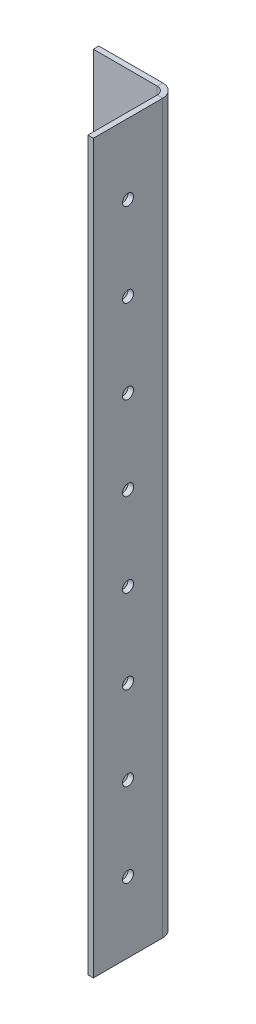
ISO-10303-21;
HEADER;
FILE_DESCRIPTION(('STEP AP214'),'2;1');
FILE_NAME('part.step','',(''),(''),'','','');
FILE_SCHEMA(('AUTOMOTIVE_DESIGN { 1 0 10303 214 1 1 1 1 }'));
ENDSEC;
DATA;
#1=APPLICATION_CONTEXT('core data for automotive mechanical design processes');
#2=APPLICATION_PROTOCOL_DEFINITION('international standard','automotive_design',2000,#1);
#3=PRODUCT_CONTEXT('',#1,'mechanical');
#4=PRODUCT('Part','Part','',(#3));
#5=PRODUCT_RELATED_PRODUCT_CATEGORY('part','',(#4));
#6=PRODUCT_DEFINITION_FORMATION('','',#4);
#7=PRODUCT_DEFINITION_CONTEXT('part definition',#1,'design');
#8=PRODUCT_DEFINITION('design','',#6,#7);
#9=PRODUCT_DEFINITION_SHAPE('','',#8);
#10=(LENGTH_UNIT() NAMED_UNIT(*) SI_UNIT(.MILLI.,.METRE.));
#11=(NAMED_UNIT(*) PLANE_ANGLE_UNIT() SI_UNIT($,.RADIAN.));
#12=(NAMED_UNIT(*) SI_UNIT($,.STERADIAN.) SOLID_ANGLE_UNIT());
#13=UNCERTAINTY_MEASURE_WITH_UNIT(LENGTH_MEASURE(1.E-05),#10,'distance_accuracy_value','');
#14=(GEOMETRIC_REPRESENTATION_CONTEXT(3) GLOBAL_UNCERTAINTY_ASSIGNED_CONTEXT((#13)) GLOBAL_UNIT_ASSIGNED_CONTEXT((#10,
#11,#12)) REPRESENTATION_CONTEXT('',''));
#15=CARTESIAN_POINT('',(0.,0.,0.));
#16=DIRECTION('',(0.,0.,1.));
#17=DIRECTION('',(1.,0.,0.));
#18=AXIS2_PLACEMENT_3D('',#15,#16,#17);
#19=CARTESIAN_POINT('',(-70.,660.,-10.));
#20=DIRECTION('',(0.,1.,0.));
#21=DIRECTION('',(0.,0.,1.));
#22=AXIS2_PLACEMENT_3D('',#19,#20,#21);
#23=PLANE('',#22);
#24=DIRECTION('',(-1.,0.,0.));
#25=VECTOR('',#24,1.);
#26=CARTESIAN_POINT('',(-70.,660.,0.));
#27=LINE('',#26,#25);
#28=CARTESIAN_POINT('',(46.0000000000001,660.,0.));
#29=VERTEX_POINT('',#28);
#30=CARTESIAN_POINT('',(-70.,660.,0.));
#31=VERTEX_POINT('',#30);
#32=EDGE_CURVE('E104',#29,#31,#27,.T.);
#33=ORIENTED_EDGE('',*,*,#32,.F.);
#34=DIRECTION('',(0.,0.,-1.));
#35=VECTOR('',#34,1.);
#36=CARTESIAN_POINT('',(46.0000000000001,660.,0.));
#37=LINE('',#36,#35);
#38=CARTESIAN_POINT('',(46.0000000000001,660.,-10.0000000000001));
#39=VERTEX_POINT('',#38);
#40=EDGE_CURVE('E117',#29,#39,#37,.T.);
#41=ORIENTED_EDGE('',*,*,#40,.T.);
#42=DIRECTION('',(-1.,0.,0.));
#43=VECTOR('',#42,1.);
#44=CARTESIAN_POINT('',(-70.,660.,-10.));
#45=LINE('',#44,#43);
#46=CARTESIAN_POINT('',(-70.,660.,-10.));
#47=VERTEX_POINT('',#46);
#48=EDGE_CURVE('E109',#39,#47,#45,.T.);
#49=ORIENTED_EDGE('',*,*,#48,.T.);
#50=DIRECTION('',(0.,0.,1.));
#51=VECTOR('',#50,1.);
#52=CARTESIAN_POINT('',(-70.,660.,-10.));
#53=LINE('',#52,#51);
#54=EDGE_CURVE('E59',#47,#31,#53,.T.);
#55=ORIENTED_EDGE('',*,*,#54,.T.);
#56=EDGE_LOOP('',(#33,#41,#49,#55));
#57=FACE_BOUND('',#56,.T.);
#58=ADVANCED_FACE('F56',(#57),#23,.T.);
#59=CARTESIAN_POINT('',(0.,0.,-10.));
#60=DIRECTION('',(0.,0.,-1.));
#61=DIRECTION('',(-1.,0.,0.));
#62=AXIS2_PLACEMENT_3D('',#59,#60,#61);
#63=PLANE('',#62);
#64=CARTESIAN_POINT('',(-7.00000000000001,380.,-9.99999999999999));
#65=DIRECTION('',(0.,0.,1.));
#66=DIRECTION('',(1.,0.,0.));
#67=AXIS2_PLACEMENT_3D('',#64,#65,#66);
#68=CIRCLE('',#67,10.);
#69=CARTESIAN_POINT('',(3.00000000000001,380.,-9.99999999999999));
#70=VERTEX_POINT('',#69);
#71=EDGE_CURVE('E192',#70,#70,#68,.T.);
#72=ORIENTED_EDGE('',*,*,#71,.T.);
#73=EDGE_LOOP('',(#72));
#74=FACE_BOUND('',#73,.T.);
#75=CARTESIAN_POINT('',(-7.00000000000001,228.,-9.99999999999998));
#76=DIRECTION('',(0.,0.,1.));
#77=DIRECTION('',(1.,0.,0.));
#78=AXIS2_PLACEMENT_3D('',#75,#76,#77);
#79=CIRCLE('',#78,10.);
#80=CARTESIAN_POINT('',(3.00000000000001,228.,-9.99999999999998));
#81=VERTEX_POINT('',#80);
#82=EDGE_CURVE('E260',#81,#81,#79,.T.);
#83=ORIENTED_EDGE('',*,*,#82,.T.);
#84=EDGE_LOOP('',(#83));
#85=FACE_BOUND('',#84,.T.);
#86=CARTESIAN_POINT('',(-7.00000000000001,76.,-9.99999999999997));
#87=DIRECTION('',(0.,0.,1.));
#88=DIRECTION('',(1.,0.,0.));
#89=AXIS2_PLACEMENT_3D('',#86,#87,#88);
#90=CIRCLE('',#89,10.);
#91=CARTESIAN_POINT('',(3.00000000000001,76.,-9.99999999999997));
#92=VERTEX_POINT('',#91);
#93=EDGE_CURVE('E254',#92,#92,#90,.T.);
#94=ORIENTED_EDGE('',*,*,#93,.T.);
#95=EDGE_LOOP('',(#94));
#96=FACE_BOUND('',#95,.T.);
#97=CARTESIAN_POINT('',(-7.00000000000001,-76.0000000000001,-9.99999999999996));
#98=DIRECTION('',(0.,0.,1.));
#99=DIRECTION('',(1.,0.,0.));
#100=AXIS2_PLACEMENT_3D('',#97,#98,#99);
#101=CIRCLE('',#100,10.);
#102=CARTESIAN_POINT('',(3.00000000000001,-76.0000000000001,-9.99999999999996));
#103=VERTEX_POINT('',#102);
#104=EDGE_CURVE('E248',#103,#103,#101,.T.);
#105=ORIENTED_EDGE('',*,*,#104,.T.);
#106=EDGE_LOOP('',(#105));
#107=FACE_BOUND('',#106,.T.);
#108=CARTESIAN_POINT('',(-7.00000000000001,-228.,-9.99999999999995));
#109=DIRECTION('',(0.,0.,1.));
#110=DIRECTION('',(1.,0.,0.));
#111=AXIS2_PLACEMENT_3D('',#108,#109,#110);
#112=CIRCLE('',#111,10.);
#113=CARTESIAN_POINT('',(3.00000000000001,-228.,-9.99999999999995));
#114=VERTEX_POINT('',#113);
#115=EDGE_CURVE('E242',#114,#114,#112,.T.);
#116=ORIENTED_EDGE('',*,*,#115,.T.);
#117=EDGE_LOOP('',(#116));
#118=FACE_BOUND('',#117,.T.);
#119=CARTESIAN_POINT('',(-7.00000000000001,-380.,-9.99999999999994));
#120=DIRECTION('',(0.,0.,1.));
#121=DIRECTION('',(1.,0.,0.));
#122=AXIS2_PLACEMENT_3D('',#119,#120,#121);
#123=CIRCLE('',#122,10.);
#124=CARTESIAN_POINT('',(3.00000000000001,-380.,-9.99999999999994));
#125=VERTEX_POINT('',#124);
#126=EDGE_CURVE('E236',#125,#125,#123,.T.);
#127=ORIENTED_EDGE('',*,*,#126,.T.);
#128=EDGE_LOOP('',(#127));
#129=FACE_BOUND('',#128,.T.);
#130=CARTESIAN_POINT('',(-7.00000000000001,-532.,-9.99999999999993));
#131=DIRECTION('',(0.,0.,1.));
#132=DIRECTION('',(1.,0.,0.));
#133=AXIS2_PLACEMENT_3D('',#130,#131,#132);
#134=CIRCLE('',#133,10.);
#135=CARTESIAN_POINT('',(3.00000000000001,-532.,-9.99999999999993));
#136=VERTEX_POINT('',#135);
#137=EDGE_CURVE('E230',#136,#136,#134,.T.);
#138=ORIENTED_EDGE('',*,*,#137,.T.);
#139=EDGE_LOOP('',(#138));
#140=FACE_BOUND('',#139,.T.);
#141=CARTESIAN_POINT('',(-7.00000000000001,532.,-10.));
#142=DIRECTION('',(0.,0.,1.));
#143=DIRECTION('',(1.,0.,0.));
#144=AXIS2_PLACEMENT_3D('',#141,#142,#143);
#145=CIRCLE('',#144,10.);
#146=CARTESIAN_POINT('',(3.00000000000001,532.,-10.));
#147=VERTEX_POINT('',#146);
#148=EDGE_CURVE('E176',#147,#147,#145,.T.);
#149=ORIENTED_EDGE('',*,*,#148,.T.);
#150=EDGE_LOOP('',(#149));
#151=FACE_BOUND('',#150,.T.);
#152=ORIENTED_EDGE('',*,*,#48,.F.);
#153=DIRECTION('',(0.,1.,0.));
#154=VECTOR('',#153,1.);
#155=CARTESIAN_POINT('',(46.0000000000001,660.,-10.0000000000001));
#156=LINE('',#155,#154);
#157=CARTESIAN_POINT('',(46.0000000000001,-660.,-10.));
#158=VERTEX_POINT('',#157);
#159=EDGE_CURVE('E134',#39,#158,#156,.F.);
#160=ORIENTED_EDGE('',*,*,#159,.T.);
#161=DIRECTION('',(1.,0.,0.));
#162=VECTOR('',#161,1.);
#163=CARTESIAN_POINT('',(-70.,-660.,-10.));
#164=LINE('',#163,#162);
#165=CARTESIAN_POINT('',(-70.,-660.,-10.));
#166=VERTEX_POINT('',#165);
#167=EDGE_CURVE('E114',#166,#158,#164,.T.);
#168=ORIENTED_EDGE('',*,*,#167,.F.);
#169=DIRECTION('',(0.,-1.,0.));
#170=VECTOR('',#169,1.);
#171=CARTESIAN_POINT('',(-70.,-660.,-10.));
#172=LINE('',#171,#170);
#173=EDGE_CURVE('E94',#47,#166,#172,.T.);
#174=ORIENTED_EDGE('',*,*,#173,.F.);
#175=EDGE_LOOP('',(#152,#160,#168,#174));
#176=FACE_BOUND('',#175,.T.);
#177=ADVANCED_FACE('F269',(#74,#85,#96,#107,#118,#129,#140,#151,#176),#63,.T.);
#178=CARTESIAN_POINT('',(0.,0.,0.));
#179=DIRECTION('',(0.,0.,-1.));
#180=DIRECTION('',(-1.,0.,0.));
#181=AXIS2_PLACEMENT_3D('',#178,#179,#180);
#182=PLANE('',#181);
#183=CARTESIAN_POINT('',(-7.00000000000001,380.,0.));
#184=DIRECTION('',(0.,0.,1.));
#185=DIRECTION('',(1.,0.,0.));
#186=AXIS2_PLACEMENT_3D('',#183,#184,#185);
#187=CIRCLE('',#186,10.);
#188=CARTESIAN_POINT('',(3.00000000000001,380.,0.));
#189=VERTEX_POINT('',#188);
#190=EDGE_CURVE('E263',#189,#189,#187,.T.);
#191=ORIENTED_EDGE('',*,*,#190,.F.);
#192=EDGE_LOOP('',(#191));
#193=FACE_BOUND('',#192,.T.);
#194=CARTESIAN_POINT('',(-7.00000000000001,228.,0.));
#195=DIRECTION('',(0.,0.,1.));
#196=DIRECTION('',(1.,0.,0.));
#197=AXIS2_PLACEMENT_3D('',#194,#195,#196);
#198=CIRCLE('',#197,10.);
#199=CARTESIAN_POINT('',(3.00000000000001,228.,0.));
#200=VERTEX_POINT('',#199);
#201=EDGE_CURVE('E257',#200,#200,#198,.T.);
#202=ORIENTED_EDGE('',*,*,#201,.F.);
#203=EDGE_LOOP('',(#202));
#204=FACE_BOUND('',#203,.T.);
#205=CARTESIAN_POINT('',(-7.00000000000001,76.,0.));
#206=DIRECTION('',(0.,0.,1.));
#207=DIRECTION('',(1.,0.,0.));
#208=AXIS2_PLACEMENT_3D('',#205,#206,#207);
#209=CIRCLE('',#208,10.);
#210=CARTESIAN_POINT('',(3.00000000000001,76.,0.));
#211=VERTEX_POINT('',#210);
#212=EDGE_CURVE('E251',#211,#211,#209,.T.);
#213=ORIENTED_EDGE('',*,*,#212,.F.);
#214=EDGE_LOOP('',(#213));
#215=FACE_BOUND('',#214,.T.);
#216=CARTESIAN_POINT('',(-7.00000000000001,-76.0000000000001,0.));
#217=DIRECTION('',(0.,0.,1.));
#218=DIRECTION('',(1.,0.,0.));
#219=AXIS2_PLACEMENT_3D('',#216,#217,#218);
#220=CIRCLE('',#219,10.);
#221=CARTESIAN_POINT('',(3.00000000000001,-76.0000000000001,0.));
#222=VERTEX_POINT('',#221);
#223=EDGE_CURVE('E245',#222,#222,#220,.T.);
#224=ORIENTED_EDGE('',*,*,#223,.F.);
#225=EDGE_LOOP('',(#224));
#226=FACE_BOUND('',#225,.T.);
#227=CARTESIAN_POINT('',(-7.00000000000001,-228.,0.));
#228=DIRECTION('',(0.,0.,1.));
#229=DIRECTION('',(1.,0.,0.));
#230=AXIS2_PLACEMENT_3D('',#227,#228,#229);
#231=CIRCLE('',#230,10.);
#232=CARTESIAN_POINT('',(3.00000000000001,-228.,0.));
#233=VERTEX_POINT('',#232);
#234=EDGE_CURVE('E239',#233,#233,#231,.T.);
#235=ORIENTED_EDGE('',*,*,#234,.F.);
#236=EDGE_LOOP('',(#235));
#237=FACE_BOUND('',#236,.T.);
#238=CARTESIAN_POINT('',(-7.00000000000001,-380.,0.));
#239=DIRECTION('',(0.,0.,1.));
#240=DIRECTION('',(1.,0.,0.));
#241=AXIS2_PLACEMENT_3D('',#238,#239,#240);
#242=CIRCLE('',#241,10.);
#243=CARTESIAN_POINT('',(3.00000000000001,-380.,0.));
#244=VERTEX_POINT('',#243);
#245=EDGE_CURVE('E233',#244,#244,#242,.T.);
#246=ORIENTED_EDGE('',*,*,#245,.F.);
#247=EDGE_LOOP('',(#246));
#248=FACE_BOUND('',#247,.T.);
#249=CARTESIAN_POINT('',(-7.00000000000001,-532.,0.));
#250=DIRECTION('',(0.,0.,1.));
#251=DIRECTION('',(1.,0.,0.));
#252=AXIS2_PLACEMENT_3D('',#249,#250,#251);
#253=CIRCLE('',#252,10.);
#254=CARTESIAN_POINT('',(3.00000000000001,-532.,0.));
#255=VERTEX_POINT('',#254);
#256=EDGE_CURVE('E227',#255,#255,#253,.T.);
#257=ORIENTED_EDGE('',*,*,#256,.F.);
#258=EDGE_LOOP('',(#257));
#259=FACE_BOUND('',#258,.T.);
#260=CARTESIAN_POINT('',(-7.00000000000001,532.,0.));
#261=DIRECTION('',(0.,0.,1.));
#262=DIRECTION('',(1.,0.,0.));
#263=AXIS2_PLACEMENT_3D('',#260,#261,#262);
#264=CIRCLE('',#263,10.);
#265=CARTESIAN_POINT('',(3.00000000000001,532.,0.));
#266=VERTEX_POINT('',#265);
#267=EDGE_CURVE('E179',#266,#266,#264,.T.);
#268=ORIENTED_EDGE('',*,*,#267,.F.);
#269=EDGE_LOOP('',(#268));
#270=FACE_BOUND('',#269,.T.);
#271=DIRECTION('',(0.,1.,0.));
#272=VECTOR('',#271,1.);
#273=CARTESIAN_POINT('',(46.0000000000001,660.,0.));
#274=LINE('',#273,#272);
#275=CARTESIAN_POINT('',(46.0000000000001,-660.,0.));
#276=VERTEX_POINT('',#275);
#277=EDGE_CURVE('E124',#29,#276,#274,.F.);
#278=ORIENTED_EDGE('',*,*,#277,.F.);
#279=ORIENTED_EDGE('',*,*,#32,.T.);
#280=DIRECTION('',(0.,-1.,0.));
#281=VECTOR('',#280,1.);
#282=CARTESIAN_POINT('',(-70.,-660.,0.));
#283=LINE('',#282,#281);
#284=CARTESIAN_POINT('',(-70.,-660.,0.));
#285=VERTEX_POINT('',#284);
#286=EDGE_CURVE('E92',#31,#285,#283,.T.);
#287=ORIENTED_EDGE('',*,*,#286,.T.);
#288=DIRECTION('',(1.,0.,0.));
#289=VECTOR('',#288,1.);
#290=CARTESIAN_POINT('',(-70.,-660.,0.));
#291=LINE('',#290,#289);
#292=EDGE_CURVE('E101',#285,#276,#291,.T.);
#293=ORIENTED_EDGE('',*,*,#292,.T.);
#294=EDGE_LOOP('',(#278,#279,#287,#293));
#295=FACE_BOUND('',#294,.T.);
#296=ADVANCED_FACE('F99',(#193,#204,#215,#226,#237,#248,#259,#270,#295),#182,.F.);
#297=CARTESIAN_POINT('',(-70.,-660.,-10.));
#298=DIRECTION('',(0.,-1.,0.));
#299=DIRECTION('',(0.,0.,-1.));
#300=AXIS2_PLACEMENT_3D('',#297,#298,#299);
#301=PLANE('',#300);
#302=DIRECTION('',(0.,0.,-1.));
#303=VECTOR('',#302,1.);
#304=CARTESIAN_POINT('',(46.0000000000001,-660.,0.));
#305=LINE('',#304,#303);
#306=EDGE_CURVE('E108',#276,#158,#305,.T.);
#307=ORIENTED_EDGE('',*,*,#306,.F.);
#308=ORIENTED_EDGE('',*,*,#292,.F.);
#309=DIRECTION('',(0.,0.,1.));
#310=VECTOR('',#309,1.);
#311=CARTESIAN_POINT('',(-70.,-660.,-10.));
#312=LINE('',#311,#310);
#313=EDGE_CURVE('E13',#166,#285,#312,.T.);
#314=ORIENTED_EDGE('',*,*,#313,.F.);
#315=ORIENTED_EDGE('',*,*,#167,.T.);
#316=EDGE_LOOP('',(#307,#308,#314,#315));
#317=FACE_BOUND('',#316,.T.);
#318=ADVANCED_FACE('F107',(#317),#301,.T.);
#319=CARTESIAN_POINT('',(-70.,-660.,-10.));
#320=DIRECTION('',(-1.,0.,0.));
#321=DIRECTION('',(0.,0.,1.));
#322=AXIS2_PLACEMENT_3D('',#319,#320,#321);
#323=PLANE('',#322);
#324=ORIENTED_EDGE('',*,*,#286,.F.);
#325=ORIENTED_EDGE('',*,*,#54,.F.);
#326=ORIENTED_EDGE('',*,*,#173,.T.);
#327=ORIENTED_EDGE('',*,*,#313,.T.);
#328=EDGE_LOOP('',(#324,#325,#326,#327));
#329=FACE_BOUND('',#328,.T.);
#330=ADVANCED_FACE('F90',(#329),#323,.T.);
#331=CARTESIAN_POINT('',(46.0000000000001,-660.,14.));
#332=DIRECTION('',(0.,-1.,0.));
#333=DIRECTION('',(0.,0.,-1.));
#334=AXIS2_PLACEMENT_3D('',#331,#332,#333);
#335=PLANE('',#334);
#336=DIRECTION('',(-1.,0.,0.));
#337=VECTOR('',#336,1.);
#338=CARTESIAN_POINT('',(70.0000000000001,-660.,13.9999999999999));
#339=LINE('',#338,#337);
#340=CARTESIAN_POINT('',(60.0000000000001,-660.,14.));
#341=VERTEX_POINT('',#340);
#342=CARTESIAN_POINT('',(70.0000000000001,-660.,13.9999999999999));
#343=VERTEX_POINT('',#342);
#344=EDGE_CURVE('E138',#341,#343,#339,.F.);
#345=ORIENTED_EDGE('',*,*,#344,.F.);
#346=CARTESIAN_POINT('',(46.0000000000001,-660.,14.));
#347=DIRECTION('',(0.,1.,0.));
#348=DIRECTION('',(0.,0.,1.));
#349=AXIS2_PLACEMENT_3D('',#346,#347,#348);
#350=CIRCLE('',#349,14.);
#351=EDGE_CURVE('E128',#276,#341,#350,.F.);
#352=ORIENTED_EDGE('',*,*,#351,.F.);
#353=ORIENTED_EDGE('',*,*,#306,.T.);
#354=CARTESIAN_POINT('',(46.0000000000001,-660.,14.));
#355=DIRECTION('',(0.,1.,0.));
#356=DIRECTION('',(0.,0.,1.));
#357=AXIS2_PLACEMENT_3D('',#354,#355,#356);
#358=CIRCLE('',#357,24.);
#359=EDGE_CURVE('E70',#158,#343,#358,.F.);
#360=ORIENTED_EDGE('',*,*,#359,.T.);
#361=EDGE_LOOP('',(#345,#352,#353,#360));
#362=FACE_BOUND('',#361,.T.);
#363=ADVANCED_FACE('F371',(#362),#335,.T.);
#364=CARTESIAN_POINT('',(46.0000000000001,660.,13.9999999999999));
#365=DIRECTION('',(0.,-1.,0.));
#366=DIRECTION('',(0.,0.,-1.));
#367=AXIS2_PLACEMENT_3D('',#364,#365,#366);
#368=PLANE('',#367);
#369=CARTESIAN_POINT('',(46.0000000000001,660.,13.9999999999999));
#370=DIRECTION('',(0.,1.,0.));
#371=DIRECTION('',(0.,0.,1.));
#372=AXIS2_PLACEMENT_3D('',#369,#370,#371);
#373=CIRCLE('',#372,14.);
#374=CARTESIAN_POINT('',(60.0000000000001,660.,13.9999999999999));
#375=VERTEX_POINT('',#374);
#376=EDGE_CURVE('E121',#375,#29,#373,.T.);
#377=ORIENTED_EDGE('',*,*,#376,.F.);
#378=DIRECTION('',(-1.,0.,0.));
#379=VECTOR('',#378,1.);
#380=CARTESIAN_POINT('',(60.0000000000001,660.,13.9999999999999));
#381=LINE('',#380,#379);
#382=CARTESIAN_POINT('',(70.0000000000001,660.,13.9999999999999));
#383=VERTEX_POINT('',#382);
#384=EDGE_CURVE('E145',#375,#383,#381,.F.);
#385=ORIENTED_EDGE('',*,*,#384,.T.);
#386=CARTESIAN_POINT('',(46.0000000000001,660.,13.9999999999999));
#387=DIRECTION('',(0.,1.,0.));
#388=DIRECTION('',(0.,0.,1.));
#389=AXIS2_PLACEMENT_3D('',#386,#387,#388);
#390=CIRCLE('',#389,24.);
#391=EDGE_CURVE('E131',#383,#39,#390,.T.);
#392=ORIENTED_EDGE('',*,*,#391,.T.);
#393=ORIENTED_EDGE('',*,*,#40,.F.);
#394=EDGE_LOOP('',(#377,#385,#392,#393));
#395=FACE_BOUND('',#394,.T.);
#396=ADVANCED_FACE('F351',(#395),#368,.F.);
#397=CARTESIAN_POINT('',(46.0000000000001,660.,13.9999999999999));
#398=DIRECTION('',(0.,1.,0.));
#399=DIRECTION('',(1.,0.,0.));
#400=AXIS2_PLACEMENT_3D('',#397,#398,#399);
#401=CYLINDRICAL_SURFACE('',#400,24.);
#402=ORIENTED_EDGE('',*,*,#159,.F.);
#403=ORIENTED_EDGE('',*,*,#391,.F.);
#404=DIRECTION('',(0.,1.,0.));
#405=VECTOR('',#404,1.);
#406=CARTESIAN_POINT('',(70.0000000000001,-660.,13.9999999999999));
#407=LINE('',#406,#405);
#408=EDGE_CURVE('E148',#383,#343,#407,.F.);
#409=ORIENTED_EDGE('',*,*,#408,.T.);
#410=ORIENTED_EDGE('',*,*,#359,.F.);
#411=EDGE_LOOP('',(#402,#403,#409,#410));
#412=FACE_BOUND('',#411,.T.);
#413=ADVANCED_FACE('F349',(#412),#401,.T.);
#414=CARTESIAN_POINT('',(46.0000000000001,660.,13.9999999999999));
#415=DIRECTION('',(0.,1.,0.));
#416=DIRECTION('',(1.,0.,0.));
#417=AXIS2_PLACEMENT_3D('',#414,#415,#416);
#418=CYLINDRICAL_SURFACE('',#417,14.);
#419=ORIENTED_EDGE('',*,*,#277,.T.);
#420=ORIENTED_EDGE('',*,*,#351,.T.);
#421=DIRECTION('',(0.,1.,0.));
#422=VECTOR('',#421,1.);
#423=CARTESIAN_POINT('',(60.0000000000001,-660.,14.));
#424=LINE('',#423,#422);
#425=EDGE_CURVE('E141',#341,#375,#424,.T.);
#426=ORIENTED_EDGE('',*,*,#425,.T.);
#427=ORIENTED_EDGE('',*,*,#376,.T.);
#428=EDGE_LOOP('',(#419,#420,#426,#427));
#429=FACE_BOUND('',#428,.T.);
#430=ADVANCED_FACE('F370',(#429),#418,.F.);
#431=CARTESIAN_POINT('',(70.0000000000005,660.,140.));
#432=DIRECTION('',(0.,-1.,0.));
#433=DIRECTION('',(0.,0.,-1.));
#434=AXIS2_PLACEMENT_3D('',#431,#432,#433);
#435=PLANE('',#434);
#436=ORIENTED_EDGE('',*,*,#384,.F.);
#437=DIRECTION('',(0.,0.,-1.));
#438=VECTOR('',#437,1.);
#439=CARTESIAN_POINT('',(60.0000000000005,660.,140.));
#440=LINE('',#439,#438);
#441=CARTESIAN_POINT('',(60.0000000000005,660.,140.));
#442=VERTEX_POINT('',#441);
#443=EDGE_CURVE('E150',#375,#442,#440,.F.);
#444=ORIENTED_EDGE('',*,*,#443,.T.);
#445=DIRECTION('',(-1.,0.,0.));
#446=VECTOR('',#445,1.);
#447=CARTESIAN_POINT('',(70.0000000000005,660.,140.));
#448=LINE('',#447,#446);
#449=CARTESIAN_POINT('',(70.0000000000005,660.,140.));
#450=VERTEX_POINT('',#449);
#451=EDGE_CURVE('E125',#450,#442,#448,.T.);
#452=ORIENTED_EDGE('',*,*,#451,.F.);
#453=DIRECTION('',(0.,0.,1.));
#454=VECTOR('',#453,1.);
#455=CARTESIAN_POINT('',(70.,660.,-2.77776100025184E-13));
#456=LINE('',#455,#454);
#457=EDGE_CURVE('E159',#383,#450,#456,.T.);
#458=ORIENTED_EDGE('',*,*,#457,.F.);
#459=EDGE_LOOP('',(#436,#444,#452,#458));
#460=FACE_BOUND('',#459,.T.);
#461=ADVANCED_FACE('F360',(#460),#435,.F.);
#462=CARTESIAN_POINT('',(70.,-660.,0.));
#463=DIRECTION('',(0.,1.,0.));
#464=DIRECTION('',(0.,0.,1.));
#465=AXIS2_PLACEMENT_3D('',#462,#463,#464);
#466=PLANE('',#465);
#467=ORIENTED_EDGE('',*,*,#344,.T.);
#468=DIRECTION('',(0.,0.,-1.));
#469=VECTOR('',#468,1.);
#470=CARTESIAN_POINT('',(70.,-660.,-2.77776100025184E-13));
#471=LINE('',#470,#469);
#472=CARTESIAN_POINT('',(70.0000000000005,-660.,140.));
#473=VERTEX_POINT('',#472);
#474=EDGE_CURVE('E165',#473,#343,#471,.T.);
#475=ORIENTED_EDGE('',*,*,#474,.F.);
#476=DIRECTION('',(-1.,0.,0.));
#477=VECTOR('',#476,1.);
#478=CARTESIAN_POINT('',(70.0000000000005,-660.,140.));
#479=LINE('',#478,#477);
#480=CARTESIAN_POINT('',(60.0000000000005,-660.,140.));
#481=VERTEX_POINT('',#480);
#482=EDGE_CURVE('E168',#473,#481,#479,.T.);
#483=ORIENTED_EDGE('',*,*,#482,.T.);
#484=DIRECTION('',(0.,0.,1.));
#485=VECTOR('',#484,1.);
#486=CARTESIAN_POINT('',(60.,-660.,0.));
#487=LINE('',#486,#485);
#488=EDGE_CURVE('E156',#481,#341,#487,.F.);
#489=ORIENTED_EDGE('',*,*,#488,.T.);
#490=EDGE_LOOP('',(#467,#475,#483,#489));
#491=FACE_BOUND('',#490,.T.);
#492=ADVANCED_FACE('F365',(#491),#466,.F.);
#493=CARTESIAN_POINT('',(70.,0.,-2.77776100025184E-13));
#494=DIRECTION('',(-1.,0.,0.));
#495=DIRECTION('',(0.,0.,1.));
#496=AXIS2_PLACEMENT_3D('',#493,#494,#495);
#497=PLANE('',#496);
#498=CARTESIAN_POINT('',(70.0000000000003,380.,77.));
#499=DIRECTION('',(-1.,0.,0.));
#500=DIRECTION('',(0.,0.,1.));
#501=AXIS2_PLACEMENT_3D('',#498,#499,#500);
#502=CIRCLE('',#501,10.);
#503=CARTESIAN_POINT('',(70.0000000000003,380.,87.));
#504=VERTEX_POINT('',#503);
#505=EDGE_CURVE('E220',#504,#504,#502,.T.);
#506=ORIENTED_EDGE('',*,*,#505,.T.);
#507=EDGE_LOOP('',(#506));
#508=FACE_BOUND('',#507,.T.);
#509=CARTESIAN_POINT('',(70.0000000000003,228.,77.));
#510=DIRECTION('',(-1.,0.,0.));
#511=DIRECTION('',(0.,0.,1.));
#512=AXIS2_PLACEMENT_3D('',#509,#510,#511);
#513=CIRCLE('',#512,10.);
#514=CARTESIAN_POINT('',(70.0000000000003,228.,87.));
#515=VERTEX_POINT('',#514);
#516=EDGE_CURVE('E214',#515,#515,#513,.T.);
#517=ORIENTED_EDGE('',*,*,#516,.T.);
#518=EDGE_LOOP('',(#517));
#519=FACE_BOUND('',#518,.T.);
#520=CARTESIAN_POINT('',(70.0000000000003,76.,77.));
#521=DIRECTION('',(-1.,0.,0.));
#522=DIRECTION('',(0.,0.,1.));
#523=AXIS2_PLACEMENT_3D('',#520,#521,#522);
#524=CIRCLE('',#523,10.);
#525=CARTESIAN_POINT('',(70.0000000000003,76.,87.));
#526=VERTEX_POINT('',#525);
#527=EDGE_CURVE('E208',#526,#526,#524,.T.);
#528=ORIENTED_EDGE('',*,*,#527,.T.);
#529=EDGE_LOOP('',(#528));
#530=FACE_BOUND('',#529,.T.);
#531=CARTESIAN_POINT('',(70.0000000000003,-76.0000000000001,77.));
#532=DIRECTION('',(-1.,0.,0.));
#533=DIRECTION('',(0.,0.,1.));
#534=AXIS2_PLACEMENT_3D('',#531,#532,#533);
#535=CIRCLE('',#534,10.);
#536=CARTESIAN_POINT('',(70.0000000000003,-76.0000000000001,87.));
#537=VERTEX_POINT('',#536);
#538=EDGE_CURVE('E202',#537,#537,#535,.T.);
#539=ORIENTED_EDGE('',*,*,#538,.T.);
#540=EDGE_LOOP('',(#539));
#541=FACE_BOUND('',#540,.T.);
#542=CARTESIAN_POINT('',(70.0000000000003,-228.,77.));
#543=DIRECTION('',(-1.,0.,0.));
#544=DIRECTION('',(0.,0.,1.));
#545=AXIS2_PLACEMENT_3D('',#542,#543,#544);
#546=CIRCLE('',#545,10.);
#547=CARTESIAN_POINT('',(70.0000000000003,-228.,87.));
#548=VERTEX_POINT('',#547);
#549=EDGE_CURVE('E196',#548,#548,#546,.T.);
#550=ORIENTED_EDGE('',*,*,#549,.T.);
#551=EDGE_LOOP('',(#550));
#552=FACE_BOUND('',#551,.T.);
#553=CARTESIAN_POINT('',(70.0000000000003,-380.,77.));
#554=DIRECTION('',(-1.,0.,0.));
#555=DIRECTION('',(0.,0.,1.));
#556=AXIS2_PLACEMENT_3D('',#553,#554,#555);
#557=CIRCLE('',#556,10.);
#558=CARTESIAN_POINT('',(70.0000000000003,-380.,87.));
#559=VERTEX_POINT('',#558);
#560=EDGE_CURVE('E188',#559,#559,#557,.T.);
#561=ORIENTED_EDGE('',*,*,#560,.T.);
#562=EDGE_LOOP('',(#561));
#563=FACE_BOUND('',#562,.T.);
#564=CARTESIAN_POINT('',(70.0000000000003,-532.,77.));
#565=DIRECTION('',(-1.,0.,0.));
#566=DIRECTION('',(0.,0.,1.));
#567=AXIS2_PLACEMENT_3D('',#564,#565,#566);
#568=CIRCLE('',#567,10.);
#569=CARTESIAN_POINT('',(70.0000000000003,-532.,87.));
#570=VERTEX_POINT('',#569);
#571=EDGE_CURVE('E189',#570,#570,#568,.T.);
#572=ORIENTED_EDGE('',*,*,#571,.T.);
#573=EDGE_LOOP('',(#572));
#574=FACE_BOUND('',#573,.T.);
#575=CARTESIAN_POINT('',(70.0000000000003,532.,76.9999999999999));
#576=DIRECTION('',(-1.,0.,0.));
#577=DIRECTION('',(0.,0.,1.));
#578=AXIS2_PLACEMENT_3D('',#575,#576,#577);
#579=CIRCLE('',#578,10.);
#580=CARTESIAN_POINT('',(70.0000000000003,532.,86.9999999999999));
#581=VERTEX_POINT('',#580);
#582=EDGE_CURVE('E142',#581,#581,#579,.T.);
#583=ORIENTED_EDGE('',*,*,#582,.T.);
#584=EDGE_LOOP('',(#583));
#585=FACE_BOUND('',#584,.T.);
#586=ORIENTED_EDGE('',*,*,#408,.F.);
#587=ORIENTED_EDGE('',*,*,#457,.T.);
#588=DIRECTION('',(0.,-1.,0.));
#589=VECTOR('',#588,1.);
#590=CARTESIAN_POINT('',(70.0000000000005,0.,140.));
#591=LINE('',#590,#589);
#592=EDGE_CURVE('E162',#450,#473,#591,.T.);
#593=ORIENTED_EDGE('',*,*,#592,.T.);
#594=ORIENTED_EDGE('',*,*,#474,.T.);
#595=EDGE_LOOP('',(#586,#587,#593,#594));
#596=FACE_BOUND('',#595,.T.);
#597=ADVANCED_FACE('F357',(#508,#519,#530,#541,#552,#563,#574,#585,#596),#497,.F.);
#598=CARTESIAN_POINT('',(60.,0.,-2.42861286636753E-13));
#599=DIRECTION('',(-1.,0.,0.));
#600=DIRECTION('',(0.,0.,1.));
#601=AXIS2_PLACEMENT_3D('',#598,#599,#600);
#602=PLANE('',#601);
#603=CARTESIAN_POINT('',(60.0000000000003,380.,77.));
#604=DIRECTION('',(-1.,0.,0.));
#605=DIRECTION('',(0.,0.,1.));
#606=AXIS2_PLACEMENT_3D('',#603,#604,#605);
#607=CIRCLE('',#606,10.);
#608=CARTESIAN_POINT('',(60.0000000000003,380.,87.));
#609=VERTEX_POINT('',#608);
#610=EDGE_CURVE('E182',#609,#609,#607,.T.);
#611=ORIENTED_EDGE('',*,*,#610,.F.);
#612=EDGE_LOOP('',(#611));
#613=FACE_BOUND('',#612,.T.);
#614=CARTESIAN_POINT('',(60.0000000000003,228.,77.));
#615=DIRECTION('',(-1.,0.,0.));
#616=DIRECTION('',(0.,0.,1.));
#617=AXIS2_PLACEMENT_3D('',#614,#615,#616);
#618=CIRCLE('',#617,10.);
#619=CARTESIAN_POINT('',(60.0000000000003,228.,87.));
#620=VERTEX_POINT('',#619);
#621=EDGE_CURVE('E217',#620,#620,#618,.T.);
#622=ORIENTED_EDGE('',*,*,#621,.F.);
#623=EDGE_LOOP('',(#622));
#624=FACE_BOUND('',#623,.T.);
#625=CARTESIAN_POINT('',(60.0000000000003,76.,77.));
#626=DIRECTION('',(-1.,0.,0.));
#627=DIRECTION('',(0.,0.,1.));
#628=AXIS2_PLACEMENT_3D('',#625,#626,#627);
#629=CIRCLE('',#628,10.);
#630=CARTESIAN_POINT('',(60.0000000000003,76.,87.));
#631=VERTEX_POINT('',#630);
#632=EDGE_CURVE('E211',#631,#631,#629,.T.);
#633=ORIENTED_EDGE('',*,*,#632,.F.);
#634=EDGE_LOOP('',(#633));
#635=FACE_BOUND('',#634,.T.);
#636=CARTESIAN_POINT('',(60.0000000000003,-76.0000000000001,77.));
#637=DIRECTION('',(-1.,0.,0.));
#638=DIRECTION('',(0.,0.,1.));
#639=AXIS2_PLACEMENT_3D('',#636,#637,#638);
#640=CIRCLE('',#639,10.);
#641=CARTESIAN_POINT('',(60.0000000000003,-76.0000000000001,87.));
#642=VERTEX_POINT('',#641);
#643=EDGE_CURVE('E205',#642,#642,#640,.T.);
#644=ORIENTED_EDGE('',*,*,#643,.F.);
#645=EDGE_LOOP('',(#644));
#646=FACE_BOUND('',#645,.T.);
#647=CARTESIAN_POINT('',(60.0000000000003,-228.,77.));
#648=DIRECTION('',(-1.,0.,0.));
#649=DIRECTION('',(0.,0.,1.));
#650=AXIS2_PLACEMENT_3D('',#647,#648,#649);
#651=CIRCLE('',#650,10.);
#652=CARTESIAN_POINT('',(60.0000000000003,-228.,87.));
#653=VERTEX_POINT('',#652);
#654=EDGE_CURVE('E199',#653,#653,#651,.T.);
#655=ORIENTED_EDGE('',*,*,#654,.F.);
#656=EDGE_LOOP('',(#655));
#657=FACE_BOUND('',#656,.T.);
#658=CARTESIAN_POINT('',(60.0000000000003,-380.,77.));
#659=DIRECTION('',(-1.,0.,0.));
#660=DIRECTION('',(0.,0.,1.));
#661=AXIS2_PLACEMENT_3D('',#658,#659,#660);
#662=CIRCLE('',#661,10.);
#663=CARTESIAN_POINT('',(60.0000000000003,-380.,87.));
#664=VERTEX_POINT('',#663);
#665=EDGE_CURVE('E193',#664,#664,#662,.T.);
#666=ORIENTED_EDGE('',*,*,#665,.F.);
#667=EDGE_LOOP('',(#666));
#668=FACE_BOUND('',#667,.T.);
#669=CARTESIAN_POINT('',(60.0000000000003,-532.,77.));
#670=DIRECTION('',(-1.,0.,0.));
#671=DIRECTION('',(0.,0.,1.));
#672=AXIS2_PLACEMENT_3D('',#669,#670,#671);
#673=CIRCLE('',#672,10.);
#674=CARTESIAN_POINT('',(60.0000000000003,-532.,87.));
#675=VERTEX_POINT('',#674);
#676=EDGE_CURVE('E185',#675,#675,#673,.T.);
#677=ORIENTED_EDGE('',*,*,#676,.F.);
#678=EDGE_LOOP('',(#677));
#679=FACE_BOUND('',#678,.T.);
#680=CARTESIAN_POINT('',(60.0000000000003,532.,77.));
#681=DIRECTION('',(-1.,0.,0.));
#682=DIRECTION('',(0.,0.,1.));
#683=AXIS2_PLACEMENT_3D('',#680,#681,#682);
#684=CIRCLE('',#683,10.);
#685=CARTESIAN_POINT('',(60.0000000000003,532.,87.));
#686=VERTEX_POINT('',#685);
#687=EDGE_CURVE('E173',#686,#686,#684,.T.);
#688=ORIENTED_EDGE('',*,*,#687,.F.);
#689=EDGE_LOOP('',(#688));
#690=FACE_BOUND('',#689,.T.);
#691=ORIENTED_EDGE('',*,*,#443,.F.);
#692=ORIENTED_EDGE('',*,*,#425,.F.);
#693=ORIENTED_EDGE('',*,*,#488,.F.);
#694=DIRECTION('',(0.,1.,0.));
#695=VECTOR('',#694,1.);
#696=CARTESIAN_POINT('',(60.0000000000005,-660.,140.));
#697=LINE('',#696,#695);
#698=EDGE_CURVE('E153',#442,#481,#697,.F.);
#699=ORIENTED_EDGE('',*,*,#698,.F.);
#700=EDGE_LOOP('',(#691,#692,#693,#699));
#701=FACE_BOUND('',#700,.T.);
#702=ADVANCED_FACE('F368',(#613,#624,#635,#646,#657,#668,#679,#690,#701),#602,.T.);
#703=CARTESIAN_POINT('',(70.0000000000005,-660.,140.));
#704=DIRECTION('',(0.,0.,-1.));
#705=DIRECTION('',(-1.,0.,0.));
#706=AXIS2_PLACEMENT_3D('',#703,#704,#705);
#707=PLANE('',#706);
#708=ORIENTED_EDGE('',*,*,#698,.T.);
#709=ORIENTED_EDGE('',*,*,#482,.F.);
#710=ORIENTED_EDGE('',*,*,#592,.F.);
#711=ORIENTED_EDGE('',*,*,#451,.T.);
#712=EDGE_LOOP('',(#708,#709,#710,#711));
#713=FACE_BOUND('',#712,.T.);
#714=ADVANCED_FACE('F309',(#713),#707,.F.);
#715=CARTESIAN_POINT('',(70.0000000000003,532.,76.9999999999999));
#716=DIRECTION('',(-1.,0.,0.));
#717=DIRECTION('',(0.,0.,1.));
#718=AXIS2_PLACEMENT_3D('',#715,#716,#717);
#719=CYLINDRICAL_SURFACE('',#718,10.);
#720=ORIENTED_EDGE('',*,*,#582,.F.);
#721=EDGE_LOOP('',(#720));
#722=FACE_BOUND('',#721,.T.);
#723=ORIENTED_EDGE('',*,*,#687,.T.);
#724=EDGE_LOOP('',(#723));
#725=FACE_BOUND('',#724,.T.);
#726=ADVANCED_FACE('F299',(#722,#725),#719,.F.);
#727=CARTESIAN_POINT('',(-7.00000000000001,532.,-10.));
#728=DIRECTION('',(0.,0.,1.));
#729=DIRECTION('',(1.,0.,0.));
#730=AXIS2_PLACEMENT_3D('',#727,#728,#729);
#731=CYLINDRICAL_SURFACE('',#730,10.);
#732=ORIENTED_EDGE('',*,*,#148,.F.);
#733=EDGE_LOOP('',(#732));
#734=FACE_BOUND('',#733,.T.);
#735=ORIENTED_EDGE('',*,*,#267,.T.);
#736=EDGE_LOOP('',(#735));
#737=FACE_BOUND('',#736,.T.);
#738=ADVANCED_FACE('F296',(#734,#737),#731,.F.);
#739=CARTESIAN_POINT('',(70.0000000000003,-532.,77.));
#740=DIRECTION('',(-1.,0.,0.));
#741=DIRECTION('',(0.,0.,1.));
#742=AXIS2_PLACEMENT_3D('',#739,#740,#741);
#743=CYLINDRICAL_SURFACE('',#742,10.);
#744=ORIENTED_EDGE('',*,*,#571,.F.);
#745=EDGE_LOOP('',(#744));
#746=FACE_BOUND('',#745,.T.);
#747=ORIENTED_EDGE('',*,*,#676,.T.);
#748=EDGE_LOOP('',(#747));
#749=FACE_BOUND('',#748,.T.);
#750=ADVANCED_FACE('F298',(#746,#749),#743,.F.);
#751=CARTESIAN_POINT('',(70.0000000000003,-380.,77.));
#752=DIRECTION('',(-1.,0.,0.));
#753=DIRECTION('',(0.,0.,1.));
#754=AXIS2_PLACEMENT_3D('',#751,#752,#753);
#755=CYLINDRICAL_SURFACE('',#754,10.);
#756=ORIENTED_EDGE('',*,*,#560,.F.);
#757=EDGE_LOOP('',(#756));
#758=FACE_BOUND('',#757,.T.);
#759=ORIENTED_EDGE('',*,*,#665,.T.);
#760=EDGE_LOOP('',(#759));
#761=FACE_BOUND('',#760,.T.);
#762=ADVANCED_FACE('F306',(#758,#761),#755,.F.);
#763=CARTESIAN_POINT('',(70.0000000000003,-228.,77.));
#764=DIRECTION('',(-1.,0.,0.));
#765=DIRECTION('',(0.,0.,1.));
#766=AXIS2_PLACEMENT_3D('',#763,#764,#765);
#767=CYLINDRICAL_SURFACE('',#766,10.);
#768=ORIENTED_EDGE('',*,*,#549,.F.);
#769=EDGE_LOOP('',(#768));
#770=FACE_BOUND('',#769,.T.);
#771=ORIENTED_EDGE('',*,*,#654,.T.);
#772=EDGE_LOOP('',(#771));
#773=FACE_BOUND('',#772,.T.);
#774=ADVANCED_FACE('F496',(#770,#773),#767,.F.);
#775=CARTESIAN_POINT('',(70.0000000000003,-76.0000000000001,77.));
#776=DIRECTION('',(-1.,0.,0.));
#777=DIRECTION('',(0.,0.,1.));
#778=AXIS2_PLACEMENT_3D('',#775,#776,#777);
#779=CYLINDRICAL_SURFACE('',#778,10.);
#780=ORIENTED_EDGE('',*,*,#538,.F.);
#781=EDGE_LOOP('',(#780));
#782=FACE_BOUND('',#781,.T.);
#783=ORIENTED_EDGE('',*,*,#643,.T.);
#784=EDGE_LOOP('',(#783));
#785=FACE_BOUND('',#784,.T.);
#786=ADVANCED_FACE('F505',(#782,#785),#779,.F.);
#787=CARTESIAN_POINT('',(70.0000000000003,76.,77.));
#788=DIRECTION('',(-1.,0.,0.));
#789=DIRECTION('',(0.,0.,1.));
#790=AXIS2_PLACEMENT_3D('',#787,#788,#789);
#791=CYLINDRICAL_SURFACE('',#790,10.);
#792=ORIENTED_EDGE('',*,*,#527,.F.);
#793=EDGE_LOOP('',(#792));
#794=FACE_BOUND('',#793,.T.);
#795=ORIENTED_EDGE('',*,*,#632,.T.);
#796=EDGE_LOOP('',(#795));
#797=FACE_BOUND('',#796,.T.);
#798=ADVANCED_FACE('F514',(#794,#797),#791,.F.);
#799=CARTESIAN_POINT('',(70.0000000000003,228.,77.));
#800=DIRECTION('',(-1.,0.,0.));
#801=DIRECTION('',(0.,0.,1.));
#802=AXIS2_PLACEMENT_3D('',#799,#800,#801);
#803=CYLINDRICAL_SURFACE('',#802,10.);
#804=ORIENTED_EDGE('',*,*,#516,.F.);
#805=EDGE_LOOP('',(#804));
#806=FACE_BOUND('',#805,.T.);
#807=ORIENTED_EDGE('',*,*,#621,.T.);
#808=EDGE_LOOP('',(#807));
#809=FACE_BOUND('',#808,.T.);
#810=ADVANCED_FACE('F523',(#806,#809),#803,.F.);
#811=CARTESIAN_POINT('',(70.0000000000003,380.,77.));
#812=DIRECTION('',(-1.,0.,0.));
#813=DIRECTION('',(0.,0.,1.));
#814=AXIS2_PLACEMENT_3D('',#811,#812,#813);
#815=CYLINDRICAL_SURFACE('',#814,10.);
#816=ORIENTED_EDGE('',*,*,#505,.F.);
#817=EDGE_LOOP('',(#816));
#818=FACE_BOUND('',#817,.T.);
#819=ORIENTED_EDGE('',*,*,#610,.T.);
#820=EDGE_LOOP('',(#819));
#821=FACE_BOUND('',#820,.T.);
#822=ADVANCED_FACE('F532',(#818,#821),#815,.F.);
#823=CARTESIAN_POINT('',(-7.00000000000001,-532.,-9.99999999999993));
#824=DIRECTION('',(0.,0.,1.));
#825=DIRECTION('',(1.,0.,0.));
#826=AXIS2_PLACEMENT_3D('',#823,#824,#825);
#827=CYLINDRICAL_SURFACE('',#826,10.);
#828=ORIENTED_EDGE('',*,*,#137,.F.);
#829=EDGE_LOOP('',(#828));
#830=FACE_BOUND('',#829,.T.);
#831=ORIENTED_EDGE('',*,*,#256,.T.);
#832=EDGE_LOOP('',(#831));
#833=FACE_BOUND('',#832,.T.);
#834=ADVANCED_FACE('F541',(#830,#833),#827,.F.);
#835=CARTESIAN_POINT('',(-7.00000000000001,-380.,-9.99999999999994));
#836=DIRECTION('',(0.,0.,1.));
#837=DIRECTION('',(1.,0.,0.));
#838=AXIS2_PLACEMENT_3D('',#835,#836,#837);
#839=CYLINDRICAL_SURFACE('',#838,10.);
#840=ORIENTED_EDGE('',*,*,#126,.F.);
#841=EDGE_LOOP('',(#840));
#842=FACE_BOUND('',#841,.T.);
#843=ORIENTED_EDGE('',*,*,#245,.T.);
#844=EDGE_LOOP('',(#843));
#845=FACE_BOUND('',#844,.T.);
#846=ADVANCED_FACE('F550',(#842,#845),#839,.F.);
#847=CARTESIAN_POINT('',(-7.00000000000001,-228.,-9.99999999999995));
#848=DIRECTION('',(0.,0.,1.));
#849=DIRECTION('',(1.,0.,0.));
#850=AXIS2_PLACEMENT_3D('',#847,#848,#849);
#851=CYLINDRICAL_SURFACE('',#850,10.);
#852=ORIENTED_EDGE('',*,*,#115,.F.);
#853=EDGE_LOOP('',(#852));
#854=FACE_BOUND('',#853,.T.);
#855=ORIENTED_EDGE('',*,*,#234,.T.);
#856=EDGE_LOOP('',(#855));
#857=FACE_BOUND('',#856,.T.);
#858=ADVANCED_FACE('F559',(#854,#857),#851,.F.);
#859=CARTESIAN_POINT('',(-7.00000000000001,-76.0000000000001,-9.99999999999996));
#860=DIRECTION('',(0.,0.,1.));
#861=DIRECTION('',(1.,0.,0.));
#862=AXIS2_PLACEMENT_3D('',#859,#860,#861);
#863=CYLINDRICAL_SURFACE('',#862,10.);
#864=ORIENTED_EDGE('',*,*,#104,.F.);
#865=EDGE_LOOP('',(#864));
#866=FACE_BOUND('',#865,.T.);
#867=ORIENTED_EDGE('',*,*,#223,.T.);
#868=EDGE_LOOP('',(#867));
#869=FACE_BOUND('',#868,.T.);
#870=ADVANCED_FACE('F568',(#866,#869),#863,.F.);
#871=CARTESIAN_POINT('',(-7.00000000000001,76.,-9.99999999999997));
#872=DIRECTION('',(0.,0.,1.));
#873=DIRECTION('',(1.,0.,0.));
#874=AXIS2_PLACEMENT_3D('',#871,#872,#873);
#875=CYLINDRICAL_SURFACE('',#874,10.);
#876=ORIENTED_EDGE('',*,*,#93,.F.);
#877=EDGE_LOOP('',(#876));
#878=FACE_BOUND('',#877,.T.);
#879=ORIENTED_EDGE('',*,*,#212,.T.);
#880=EDGE_LOOP('',(#879));
#881=FACE_BOUND('',#880,.T.);
#882=ADVANCED_FACE('F577',(#878,#881),#875,.F.);
#883=CARTESIAN_POINT('',(-7.00000000000001,228.,-9.99999999999998));
#884=DIRECTION('',(0.,0.,1.));
#885=DIRECTION('',(1.,0.,0.));
#886=AXIS2_PLACEMENT_3D('',#883,#884,#885);
#887=CYLINDRICAL_SURFACE('',#886,10.);
#888=ORIENTED_EDGE('',*,*,#82,.F.);
#889=EDGE_LOOP('',(#888));
#890=FACE_BOUND('',#889,.T.);
#891=ORIENTED_EDGE('',*,*,#201,.T.);
#892=EDGE_LOOP('',(#891));
#893=FACE_BOUND('',#892,.T.);
#894=ADVANCED_FACE('F275',(#890,#893),#887,.F.);
#895=CARTESIAN_POINT('',(-7.00000000000001,380.,-9.99999999999999));
#896=DIRECTION('',(0.,0.,1.));
#897=DIRECTION('',(1.,0.,0.));
#898=AXIS2_PLACEMENT_3D('',#895,#896,#897);
#899=CYLINDRICAL_SURFACE('',#898,10.);
#900=ORIENTED_EDGE('',*,*,#71,.F.);
#901=EDGE_LOOP('',(#900));
#902=FACE_BOUND('',#901,.T.);
#903=ORIENTED_EDGE('',*,*,#190,.T.);
#904=EDGE_LOOP('',(#903));
#905=FACE_BOUND('',#904,.T.);
#906=ADVANCED_FACE('F272',(#902,#905),#899,.F.);
#907=CLOSED_SHELL('',(#58,#177,#296,#318,#330,#363,#396,#413,#430,#461,#492,#597,#702,#714,#726,
#738,#750,#762,#774,#786,#798,#810,#822,#834,#846,#858,#870,#882,#894,#906));
#908=MANIFOLD_SOLID_BREP('B2',#907);
#909=ADVANCED_BREP_SHAPE_REPRESENTATION('',(#18,#908),#14);
#910=SHAPE_DEFINITION_REPRESENTATION(#9,#909);
ENDSEC;
END-ISO-10303-21;
